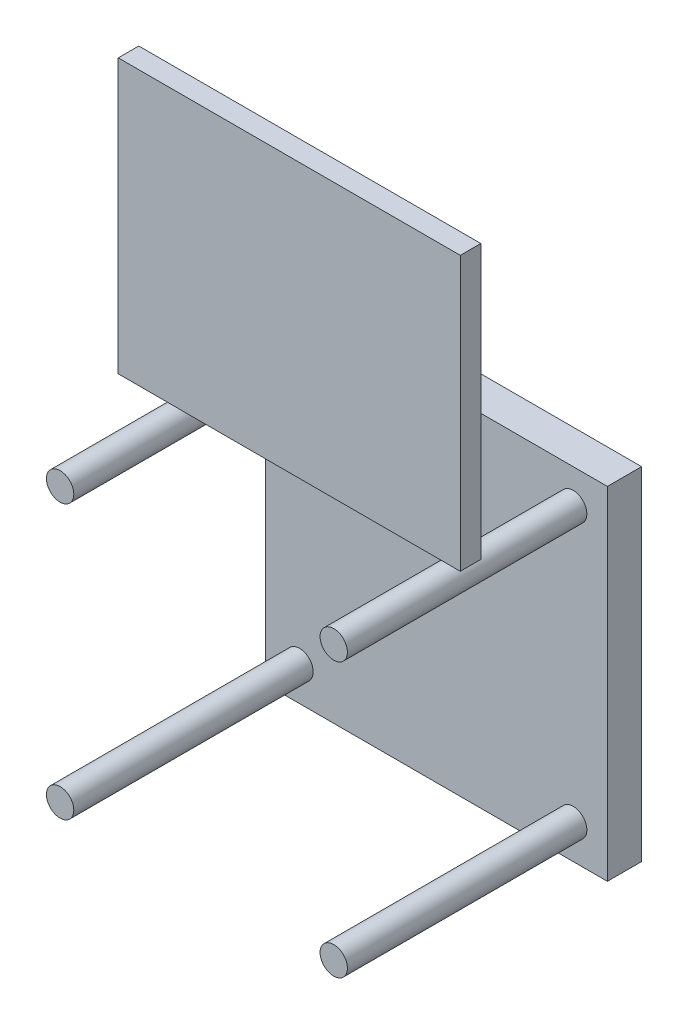
ISO-10303-21;
HEADER;
FILE_DESCRIPTION(('STEP AP214'),'2;1');
FILE_NAME('part.step','',(''),(''),'','','');
FILE_SCHEMA(('AUTOMOTIVE_DESIGN { 1 0 10303 214 1 1 1 1 }'));
ENDSEC;
DATA;
#1=APPLICATION_CONTEXT('core data for automotive mechanical design processes');
#2=APPLICATION_PROTOCOL_DEFINITION('international standard','automotive_design',2000,#1);
#3=PRODUCT_CONTEXT('',#1,'mechanical');
#4=PRODUCT('Part','Part','',(#3));
#5=PRODUCT_RELATED_PRODUCT_CATEGORY('part','',(#4));
#6=PRODUCT_DEFINITION_FORMATION('','',#4);
#7=PRODUCT_DEFINITION_CONTEXT('part definition',#1,'design');
#8=PRODUCT_DEFINITION('design','',#6,#7);
#9=PRODUCT_DEFINITION_SHAPE('','',#8);
#10=(LENGTH_UNIT() NAMED_UNIT(*) SI_UNIT(.MILLI.,.METRE.));
#11=(NAMED_UNIT(*) PLANE_ANGLE_UNIT() SI_UNIT($,.RADIAN.));
#12=(NAMED_UNIT(*) SI_UNIT($,.STERADIAN.) SOLID_ANGLE_UNIT());
#13=UNCERTAINTY_MEASURE_WITH_UNIT(LENGTH_MEASURE(1.E-05),#10,'distance_accuracy_value','');
#14=(GEOMETRIC_REPRESENTATION_CONTEXT(3) GLOBAL_UNCERTAINTY_ASSIGNED_CONTEXT((#13)) GLOBAL_UNIT_ASSIGNED_CONTEXT((#10,
#11,#12)) REPRESENTATION_CONTEXT('',''));
#15=CARTESIAN_POINT('',(0.,0.,0.));
#16=DIRECTION('',(0.,0.,1.));
#17=DIRECTION('',(1.,0.,0.));
#18=AXIS2_PLACEMENT_3D('',#15,#16,#17);
#19=CARTESIAN_POINT('',(250.,650.,265.));
#20=DIRECTION('',(-1.,0.,0.));
#21=DIRECTION('',(0.,0.,1.));
#22=AXIS2_PLACEMENT_3D('',#19,#20,#21);
#23=PLANE('',#22);
#24=DIRECTION('',(0.,0.,-1.));
#25=VECTOR('',#24,1.);
#26=CARTESIAN_POINT('',(250.,250.,265.));
#27=LINE('',#26,#25);
#28=CARTESIAN_POINT('',(250.,250.,265.));
#29=VERTEX_POINT('',#28);
#30=CARTESIAN_POINT('',(250.,250.,235.));
#31=VERTEX_POINT('',#30);
#32=EDGE_CURVE('E114',#29,#31,#27,.T.);
#33=ORIENTED_EDGE('',*,*,#32,.T.);
#34=DIRECTION('',(0.,-1.,0.));
#35=VECTOR('',#34,1.);
#36=CARTESIAN_POINT('',(250.,650.,235.));
#37=LINE('',#36,#35);
#38=CARTESIAN_POINT('',(250.,650.,235.));
#39=VERTEX_POINT('',#38);
#40=EDGE_CURVE('E12',#39,#31,#37,.T.);
#41=ORIENTED_EDGE('',*,*,#40,.F.);
#42=DIRECTION('',(0.,0.,-1.));
#43=VECTOR('',#42,1.);
#44=CARTESIAN_POINT('',(250.,650.,265.));
#45=LINE('',#44,#43);
#46=CARTESIAN_POINT('',(250.,650.,265.));
#47=VERTEX_POINT('',#46);
#48=EDGE_CURVE('E102',#47,#39,#45,.T.);
#49=ORIENTED_EDGE('',*,*,#48,.F.);
#50=DIRECTION('',(0.,-1.,0.));
#51=VECTOR('',#50,1.);
#52=CARTESIAN_POINT('',(250.,650.,265.));
#53=LINE('',#52,#51);
#54=EDGE_CURVE('E110',#47,#29,#53,.T.);
#55=ORIENTED_EDGE('',*,*,#54,.T.);
#56=EDGE_LOOP('',(#33,#41,#49,#55));
#57=FACE_BOUND('',#56,.T.);
#58=ADVANCED_FACE('F51',(#57),#23,.F.);
#59=CARTESIAN_POINT('',(-250.,650.,235.));
#60=DIRECTION('',(0.,0.,1.));
#61=DIRECTION('',(1.,0.,0.));
#62=AXIS2_PLACEMENT_3D('',#59,#60,#61);
#63=PLANE('',#62);
#64=DIRECTION('',(-1.,0.,0.));
#65=VECTOR('',#64,1.);
#66=CARTESIAN_POINT('',(-250.,250.,235.));
#67=LINE('',#66,#65);
#68=CARTESIAN_POINT('',(-250.,250.,235.));
#69=VERTEX_POINT('',#68);
#70=EDGE_CURVE('E106',#31,#69,#67,.T.);
#71=ORIENTED_EDGE('',*,*,#70,.T.);
#72=DIRECTION('',(0.,-1.,0.));
#73=VECTOR('',#72,1.);
#74=CARTESIAN_POINT('',(-250.,650.,235.));
#75=LINE('',#74,#73);
#76=CARTESIAN_POINT('',(-250.,650.,235.));
#77=VERTEX_POINT('',#76);
#78=EDGE_CURVE('E59',#77,#69,#75,.T.);
#79=ORIENTED_EDGE('',*,*,#78,.F.);
#80=DIRECTION('',(-1.,0.,0.));
#81=VECTOR('',#80,1.);
#82=CARTESIAN_POINT('',(-250.,650.,235.));
#83=LINE('',#82,#81);
#84=EDGE_CURVE('E97',#39,#77,#83,.T.);
#85=ORIENTED_EDGE('',*,*,#84,.F.);
#86=ORIENTED_EDGE('',*,*,#40,.T.);
#87=EDGE_LOOP('',(#71,#79,#85,#86));
#88=FACE_BOUND('',#87,.T.);
#89=ADVANCED_FACE('F105',(#88),#63,.F.);
#90=CARTESIAN_POINT('',(-250.,650.,265.));
#91=DIRECTION('',(1.,0.,0.));
#92=DIRECTION('',(0.,0.,-1.));
#93=AXIS2_PLACEMENT_3D('',#90,#91,#92);
#94=PLANE('',#93);
#95=DIRECTION('',(0.,0.,1.));
#96=VECTOR('',#95,1.);
#97=CARTESIAN_POINT('',(-250.,250.,265.));
#98=LINE('',#97,#96);
#99=CARTESIAN_POINT('',(-250.,250.,265.));
#100=VERTEX_POINT('',#99);
#101=EDGE_CURVE('E84',#69,#100,#98,.T.);
#102=ORIENTED_EDGE('',*,*,#101,.T.);
#103=DIRECTION('',(0.,-1.,0.));
#104=VECTOR('',#103,1.);
#105=CARTESIAN_POINT('',(-250.,650.,265.));
#106=LINE('',#105,#104);
#107=CARTESIAN_POINT('',(-250.,650.,265.));
#108=VERTEX_POINT('',#107);
#109=EDGE_CURVE('E107',#108,#100,#106,.T.);
#110=ORIENTED_EDGE('',*,*,#109,.F.);
#111=DIRECTION('',(0.,0.,1.));
#112=VECTOR('',#111,1.);
#113=CARTESIAN_POINT('',(-250.,650.,265.));
#114=LINE('',#113,#112);
#115=EDGE_CURVE('E100',#77,#108,#114,.T.);
#116=ORIENTED_EDGE('',*,*,#115,.F.);
#117=ORIENTED_EDGE('',*,*,#78,.T.);
#118=EDGE_LOOP('',(#102,#110,#116,#117));
#119=FACE_BOUND('',#118,.T.);
#120=ADVANCED_FACE('F108',(#119),#94,.F.);
#121=CARTESIAN_POINT('',(-250.,650.,265.));
#122=DIRECTION('',(0.,0.,-1.));
#123=DIRECTION('',(-1.,0.,0.));
#124=AXIS2_PLACEMENT_3D('',#121,#122,#123);
#125=PLANE('',#124);
#126=DIRECTION('',(1.,0.,0.));
#127=VECTOR('',#126,1.);
#128=CARTESIAN_POINT('',(-250.,250.,265.));
#129=LINE('',#128,#127);
#130=EDGE_CURVE('E90',#100,#29,#129,.T.);
#131=ORIENTED_EDGE('',*,*,#130,.T.);
#132=ORIENTED_EDGE('',*,*,#54,.F.);
#133=DIRECTION('',(1.,0.,0.));
#134=VECTOR('',#133,1.);
#135=CARTESIAN_POINT('',(-250.,650.,265.));
#136=LINE('',#135,#134);
#137=EDGE_CURVE('E67',#108,#47,#136,.T.);
#138=ORIENTED_EDGE('',*,*,#137,.F.);
#139=ORIENTED_EDGE('',*,*,#109,.T.);
#140=EDGE_LOOP('',(#131,#132,#138,#139));
#141=FACE_BOUND('',#140,.T.);
#142=ADVANCED_FACE('F121',(#141),#125,.F.);
#143=CARTESIAN_POINT('',(0.,650.,0.));
#144=DIRECTION('',(0.,-1.,0.));
#145=DIRECTION('',(0.,0.,-1.));
#146=AXIS2_PLACEMENT_3D('',#143,#144,#145);
#147=PLANE('',#146);
#148=ORIENTED_EDGE('',*,*,#48,.T.);
#149=ORIENTED_EDGE('',*,*,#84,.T.);
#150=ORIENTED_EDGE('',*,*,#115,.T.);
#151=ORIENTED_EDGE('',*,*,#137,.T.);
#152=EDGE_LOOP('',(#148,#149,#150,#151));
#153=FACE_BOUND('',#152,.T.);
#154=ADVANCED_FACE('F98',(#153),#147,.F.);
#155=CARTESIAN_POINT('',(0.,250.,0.));
#156=DIRECTION('',(0.,-1.,0.));
#157=DIRECTION('',(0.,0.,-1.));
#158=AXIS2_PLACEMENT_3D('',#155,#156,#157);
#159=PLANE('',#158);
#160=ORIENTED_EDGE('',*,*,#32,.F.);
#161=ORIENTED_EDGE('',*,*,#130,.F.);
#162=ORIENTED_EDGE('',*,*,#101,.F.);
#163=ORIENTED_EDGE('',*,*,#70,.F.);
#164=EDGE_LOOP('',(#160,#161,#162,#163));
#165=FACE_BOUND('',#164,.T.);
#166=ADVANCED_FACE('F124',(#165),#159,.T.);
#167=CLOSED_SHELL('',(#58,#89,#120,#142,#154,#166));
#168=MANIFOLD_SOLID_BREP('B2',#167);
#169=CARTESIAN_POINT('',(250.,-250.,50.));
#170=DIRECTION('',(-1.,0.,0.));
#171=DIRECTION('',(0.,0.,1.));
#172=AXIS2_PLACEMENT_3D('',#169,#170,#171);
#173=PLANE('',#172);
#174=DIRECTION('',(0.,1.,0.));
#175=VECTOR('',#174,1.);
#176=CARTESIAN_POINT('',(250.,-250.,0.));
#177=LINE('',#176,#175);
#178=CARTESIAN_POINT('',(250.,-250.,0.));
#179=VERTEX_POINT('',#178);
#180=CARTESIAN_POINT('',(250.,250.,0.));
#181=VERTEX_POINT('',#180);
#182=EDGE_CURVE('E242',#179,#181,#177,.T.);
#183=ORIENTED_EDGE('',*,*,#182,.T.);
#184=DIRECTION('',(0.,0.,-1.));
#185=VECTOR('',#184,1.);
#186=CARTESIAN_POINT('',(250.,250.,50.));
#187=LINE('',#186,#185);
#188=CARTESIAN_POINT('',(250.,250.,50.));
#189=VERTEX_POINT('',#188);
#190=EDGE_CURVE('E178',#189,#181,#187,.T.);
#191=ORIENTED_EDGE('',*,*,#190,.F.);
#192=DIRECTION('',(0.,1.,0.));
#193=VECTOR('',#192,1.);
#194=CARTESIAN_POINT('',(250.,-250.,50.));
#195=LINE('',#194,#193);
#196=CARTESIAN_POINT('',(250.,-250.,50.));
#197=VERTEX_POINT('',#196);
#198=EDGE_CURVE('E229',#197,#189,#195,.T.);
#199=ORIENTED_EDGE('',*,*,#198,.F.);
#200=DIRECTION('',(0.,0.,-1.));
#201=VECTOR('',#200,1.);
#202=CARTESIAN_POINT('',(250.,-250.,50.));
#203=LINE('',#202,#201);
#204=EDGE_CURVE('E238',#197,#179,#203,.T.);
#205=ORIENTED_EDGE('',*,*,#204,.T.);
#206=EDGE_LOOP('',(#183,#191,#199,#205));
#207=FACE_BOUND('',#206,.T.);
#208=ADVANCED_FACE('F175',(#207),#173,.F.);
#209=CARTESIAN_POINT('',(-250.,250.,50.));
#210=DIRECTION('',(0.,-1.,0.));
#211=DIRECTION('',(0.,0.,-1.));
#212=AXIS2_PLACEMENT_3D('',#209,#210,#211);
#213=PLANE('',#212);
#214=DIRECTION('',(-1.,0.,0.));
#215=VECTOR('',#214,1.);
#216=CARTESIAN_POINT('',(-250.,250.,0.));
#217=LINE('',#216,#215);
#218=CARTESIAN_POINT('',(-250.,250.,0.));
#219=VERTEX_POINT('',#218);
#220=EDGE_CURVE('E234',#181,#219,#217,.T.);
#221=ORIENTED_EDGE('',*,*,#220,.T.);
#222=DIRECTION('',(0.,0.,-1.));
#223=VECTOR('',#222,1.);
#224=CARTESIAN_POINT('',(-250.,250.,50.));
#225=LINE('',#224,#223);
#226=CARTESIAN_POINT('',(-250.,250.,50.));
#227=VERTEX_POINT('',#226);
#228=EDGE_CURVE('E232',#227,#219,#225,.T.);
#229=ORIENTED_EDGE('',*,*,#228,.F.);
#230=DIRECTION('',(-1.,0.,0.));
#231=VECTOR('',#230,1.);
#232=CARTESIAN_POINT('',(-250.,250.,50.));
#233=LINE('',#232,#231);
#234=EDGE_CURVE('E224',#189,#227,#233,.T.);
#235=ORIENTED_EDGE('',*,*,#234,.F.);
#236=ORIENTED_EDGE('',*,*,#190,.T.);
#237=EDGE_LOOP('',(#221,#229,#235,#236));
#238=FACE_BOUND('',#237,.T.);
#239=ADVANCED_FACE('F233',(#238),#213,.F.);
#240=CARTESIAN_POINT('',(-250.,-250.,50.));
#241=DIRECTION('',(1.,0.,0.));
#242=DIRECTION('',(0.,0.,-1.));
#243=AXIS2_PLACEMENT_3D('',#240,#241,#242);
#244=PLANE('',#243);
#245=DIRECTION('',(0.,-1.,0.));
#246=VECTOR('',#245,1.);
#247=CARTESIAN_POINT('',(-250.,-250.,0.));
#248=LINE('',#247,#246);
#249=CARTESIAN_POINT('',(-250.,-250.,0.));
#250=VERTEX_POINT('',#249);
#251=EDGE_CURVE('E210',#219,#250,#248,.T.);
#252=ORIENTED_EDGE('',*,*,#251,.T.);
#253=DIRECTION('',(0.,0.,-1.));
#254=VECTOR('',#253,1.);
#255=CARTESIAN_POINT('',(-250.,-250.,50.));
#256=LINE('',#255,#254);
#257=CARTESIAN_POINT('',(-250.,-250.,50.));
#258=VERTEX_POINT('',#257);
#259=EDGE_CURVE('E235',#258,#250,#256,.T.);
#260=ORIENTED_EDGE('',*,*,#259,.F.);
#261=DIRECTION('',(0.,-1.,0.));
#262=VECTOR('',#261,1.);
#263=CARTESIAN_POINT('',(-250.,-250.,50.));
#264=LINE('',#263,#262);
#265=EDGE_CURVE('E227',#227,#258,#264,.T.);
#266=ORIENTED_EDGE('',*,*,#265,.F.);
#267=ORIENTED_EDGE('',*,*,#228,.T.);
#268=EDGE_LOOP('',(#252,#260,#266,#267));
#269=FACE_BOUND('',#268,.T.);
#270=ADVANCED_FACE('F236',(#269),#244,.F.);
#271=CARTESIAN_POINT('',(-250.,-250.,50.));
#272=DIRECTION('',(0.,1.,0.));
#273=DIRECTION('',(0.,0.,1.));
#274=AXIS2_PLACEMENT_3D('',#271,#272,#273);
#275=PLANE('',#274);
#276=DIRECTION('',(1.,0.,0.));
#277=VECTOR('',#276,1.);
#278=CARTESIAN_POINT('',(-250.,-250.,0.));
#279=LINE('',#278,#277);
#280=EDGE_CURVE('E216',#250,#179,#279,.T.);
#281=ORIENTED_EDGE('',*,*,#280,.T.);
#282=ORIENTED_EDGE('',*,*,#204,.F.);
#283=DIRECTION('',(1.,0.,0.));
#284=VECTOR('',#283,1.);
#285=CARTESIAN_POINT('',(-250.,-250.,50.));
#286=LINE('',#285,#284);
#287=EDGE_CURVE('E193',#258,#197,#286,.T.);
#288=ORIENTED_EDGE('',*,*,#287,.F.);
#289=ORIENTED_EDGE('',*,*,#259,.T.);
#290=EDGE_LOOP('',(#281,#282,#288,#289));
#291=FACE_BOUND('',#290,.T.);
#292=ADVANCED_FACE('F250',(#291),#275,.F.);
#293=CARTESIAN_POINT('',(0.,0.,50.));
#294=DIRECTION('',(0.,0.,-1.));
#295=DIRECTION('',(-1.,0.,0.));
#296=AXIS2_PLACEMENT_3D('',#293,#294,#295);
#297=PLANE('',#296);
#298=CARTESIAN_POINT('',(200.,200.,50.));
#299=DIRECTION('',(0.,0.,-1.));
#300=DIRECTION('',(-1.,0.,0.));
#301=AXIS2_PLACEMENT_3D('',#298,#299,#300);
#302=CIRCLE('',#301,20.);
#303=CARTESIAN_POINT('',(180.,200.,50.));
#304=VERTEX_POINT('',#303);
#305=EDGE_CURVE('E49',#304,#304,#302,.F.);
#306=ORIENTED_EDGE('',*,*,#305,.F.);
#307=EDGE_LOOP('',(#306));
#308=FACE_BOUND('',#307,.T.);
#309=CARTESIAN_POINT('',(-200.,200.,50.));
#310=DIRECTION('',(0.,0.,-1.));
#311=DIRECTION('',(-1.,0.,0.));
#312=AXIS2_PLACEMENT_3D('',#309,#310,#311);
#313=CIRCLE('',#312,20.);
#314=CARTESIAN_POINT('',(-220.,200.,50.));
#315=VERTEX_POINT('',#314);
#316=EDGE_CURVE('E184',#315,#315,#313,.F.);
#317=ORIENTED_EDGE('',*,*,#316,.F.);
#318=EDGE_LOOP('',(#317));
#319=FACE_BOUND('',#318,.T.);
#320=CARTESIAN_POINT('',(200.,-200.,50.));
#321=DIRECTION('',(0.,0.,-1.));
#322=DIRECTION('',(-1.,0.,0.));
#323=AXIS2_PLACEMENT_3D('',#320,#321,#322);
#324=CIRCLE('',#323,20.);
#325=CARTESIAN_POINT('',(180.,-200.,50.));
#326=VERTEX_POINT('',#325);
#327=EDGE_CURVE('E259',#326,#326,#324,.F.);
#328=ORIENTED_EDGE('',*,*,#327,.F.);
#329=EDGE_LOOP('',(#328));
#330=FACE_BOUND('',#329,.T.);
#331=CARTESIAN_POINT('',(-200.,-200.,50.));
#332=DIRECTION('',(0.,0.,-1.));
#333=DIRECTION('',(-1.,0.,0.));
#334=AXIS2_PLACEMENT_3D('',#331,#332,#333);
#335=CIRCLE('',#334,20.);
#336=CARTESIAN_POINT('',(-220.,-200.,50.));
#337=VERTEX_POINT('',#336);
#338=EDGE_CURVE('E256',#337,#337,#335,.F.);
#339=ORIENTED_EDGE('',*,*,#338,.F.);
#340=EDGE_LOOP('',(#339));
#341=FACE_BOUND('',#340,.T.);
#342=ORIENTED_EDGE('',*,*,#198,.T.);
#343=ORIENTED_EDGE('',*,*,#234,.T.);
#344=ORIENTED_EDGE('',*,*,#265,.T.);
#345=ORIENTED_EDGE('',*,*,#287,.T.);
#346=EDGE_LOOP('',(#342,#343,#344,#345));
#347=FACE_BOUND('',#346,.T.);
#348=ADVANCED_FACE('F225',(#308,#319,#330,#341,#347),#297,.F.);
#349=CARTESIAN_POINT('',(0.,0.,0.));
#350=DIRECTION('',(0.,0.,-1.));
#351=DIRECTION('',(-1.,0.,0.));
#352=AXIS2_PLACEMENT_3D('',#349,#350,#351);
#353=PLANE('',#352);
#354=ORIENTED_EDGE('',*,*,#182,.F.);
#355=ORIENTED_EDGE('',*,*,#280,.F.);
#356=ORIENTED_EDGE('',*,*,#251,.F.);
#357=ORIENTED_EDGE('',*,*,#220,.F.);
#358=EDGE_LOOP('',(#354,#355,#356,#357));
#359=FACE_BOUND('',#358,.T.);
#360=ADVANCED_FACE('F253',(#359),#353,.T.);
#361=CARTESIAN_POINT('',(-200.,-200.,400.));
#362=DIRECTION('',(0.,0.,-1.));
#363=DIRECTION('',(-1.,0.,0.));
#364=AXIS2_PLACEMENT_3D('',#361,#362,#363);
#365=CYLINDRICAL_SURFACE('',#364,20.);
#366=CARTESIAN_POINT('',(-200.,-200.,400.));
#367=DIRECTION('',(0.,0.,1.));
#368=DIRECTION('',(1.,0.,0.));
#369=AXIS2_PLACEMENT_3D('',#366,#367,#368);
#370=CIRCLE('',#369,20.);
#371=CARTESIAN_POINT('',(-180.,-200.,400.));
#372=VERTEX_POINT('',#371);
#373=EDGE_CURVE('E245',#372,#372,#370,.T.);
#374=ORIENTED_EDGE('',*,*,#373,.F.);
#375=EDGE_LOOP('',(#374));
#376=FACE_BOUND('',#375,.T.);
#377=ORIENTED_EDGE('',*,*,#338,.T.);
#378=EDGE_LOOP('',(#377));
#379=FACE_BOUND('',#378,.T.);
#380=ADVANCED_FACE('F294',(#376,#379),#365,.T.);
#381=CARTESIAN_POINT('',(-200.,-200.,400.));
#382=DIRECTION('',(0.,0.,1.));
#383=DIRECTION('',(1.,0.,0.));
#384=AXIS2_PLACEMENT_3D('',#381,#382,#383);
#385=PLANE('',#384);
#386=ORIENTED_EDGE('',*,*,#373,.T.);
#387=EDGE_LOOP('',(#386));
#388=FACE_BOUND('',#387,.T.);
#389=ADVANCED_FACE('F296',(#388),#385,.T.);
#390=CARTESIAN_POINT('',(200.,-200.,400.));
#391=DIRECTION('',(0.,0.,-1.));
#392=DIRECTION('',(-1.,0.,0.));
#393=AXIS2_PLACEMENT_3D('',#390,#391,#392);
#394=CYLINDRICAL_SURFACE('',#393,20.);
#395=CARTESIAN_POINT('',(200.,-200.,400.));
#396=DIRECTION('',(0.,0.,1.));
#397=DIRECTION('',(1.,0.,0.));
#398=AXIS2_PLACEMENT_3D('',#395,#396,#397);
#399=CIRCLE('',#398,20.);
#400=CARTESIAN_POINT('',(220.,-200.,400.));
#401=VERTEX_POINT('',#400);
#402=EDGE_CURVE('E262',#401,#401,#399,.T.);
#403=ORIENTED_EDGE('',*,*,#402,.F.);
#404=EDGE_LOOP('',(#403));
#405=FACE_BOUND('',#404,.T.);
#406=ORIENTED_EDGE('',*,*,#327,.T.);
#407=EDGE_LOOP('',(#406));
#408=FACE_BOUND('',#407,.T.);
#409=ADVANCED_FACE('F303',(#405,#408),#394,.T.);
#410=CARTESIAN_POINT('',(200.,-200.,400.));
#411=DIRECTION('',(0.,0.,1.));
#412=DIRECTION('',(1.,0.,0.));
#413=AXIS2_PLACEMENT_3D('',#410,#411,#412);
#414=PLANE('',#413);
#415=ORIENTED_EDGE('',*,*,#402,.T.);
#416=EDGE_LOOP('',(#415));
#417=FACE_BOUND('',#416,.T.);
#418=ADVANCED_FACE('F362',(#417),#414,.T.);
#419=CARTESIAN_POINT('',(-200.,200.,400.));
#420=DIRECTION('',(0.,0.,-1.));
#421=DIRECTION('',(-1.,0.,0.));
#422=AXIS2_PLACEMENT_3D('',#419,#420,#421);
#423=CYLINDRICAL_SURFACE('',#422,20.);
#424=CARTESIAN_POINT('',(-200.,200.,400.));
#425=DIRECTION('',(0.,0.,1.));
#426=DIRECTION('',(1.,0.,0.));
#427=AXIS2_PLACEMENT_3D('',#424,#425,#426);
#428=CIRCLE('',#427,20.);
#429=CARTESIAN_POINT('',(-180.,200.,400.));
#430=VERTEX_POINT('',#429);
#431=EDGE_CURVE('E267',#430,#430,#428,.T.);
#432=ORIENTED_EDGE('',*,*,#431,.F.);
#433=EDGE_LOOP('',(#432));
#434=FACE_BOUND('',#433,.T.);
#435=ORIENTED_EDGE('',*,*,#316,.T.);
#436=EDGE_LOOP('',(#435));
#437=FACE_BOUND('',#436,.T.);
#438=ADVANCED_FACE('F371',(#434,#437),#423,.T.);
#439=CARTESIAN_POINT('',(-200.,200.,400.));
#440=DIRECTION('',(0.,0.,1.));
#441=DIRECTION('',(1.,0.,0.));
#442=AXIS2_PLACEMENT_3D('',#439,#440,#441);
#443=PLANE('',#442);
#444=ORIENTED_EDGE('',*,*,#431,.T.);
#445=EDGE_LOOP('',(#444));
#446=FACE_BOUND('',#445,.T.);
#447=ADVANCED_FACE('F281',(#446),#443,.T.);
#448=CARTESIAN_POINT('',(200.,200.,400.));
#449=DIRECTION('',(0.,0.,-1.));
#450=DIRECTION('',(-1.,0.,0.));
#451=AXIS2_PLACEMENT_3D('',#448,#449,#450);
#452=CYLINDRICAL_SURFACE('',#451,20.);
#453=CARTESIAN_POINT('',(200.,200.,400.));
#454=DIRECTION('',(0.,0.,1.));
#455=DIRECTION('',(1.,0.,0.));
#456=AXIS2_PLACEMENT_3D('',#453,#454,#455);
#457=CIRCLE('',#456,20.);
#458=CARTESIAN_POINT('',(220.,200.,400.));
#459=VERTEX_POINT('',#458);
#460=EDGE_CURVE('E271',#459,#459,#457,.T.);
#461=ORIENTED_EDGE('',*,*,#460,.F.);
#462=EDGE_LOOP('',(#461));
#463=FACE_BOUND('',#462,.T.);
#464=ORIENTED_EDGE('',*,*,#305,.T.);
#465=EDGE_LOOP('',(#464));
#466=FACE_BOUND('',#465,.T.);
#467=ADVANCED_FACE('F278',(#463,#466),#452,.T.);
#468=CARTESIAN_POINT('',(200.,200.,400.));
#469=DIRECTION('',(0.,0.,1.));
#470=DIRECTION('',(1.,0.,0.));
#471=AXIS2_PLACEMENT_3D('',#468,#469,#470);
#472=PLANE('',#471);
#473=ORIENTED_EDGE('',*,*,#460,.T.);
#474=EDGE_LOOP('',(#473));
#475=FACE_BOUND('',#474,.T.);
#476=ADVANCED_FACE('F276',(#475),#472,.T.);
#477=CLOSED_SHELL('',(#208,#239,#270,#292,#348,#360,#380,#389,#409,#418,#438,#447,#467,#476));
#478=MANIFOLD_SOLID_BREP('B6',#477);
#479=ADVANCED_BREP_SHAPE_REPRESENTATION('',(#18,#168,#478),#14);
#480=SHAPE_DEFINITION_REPRESENTATION(#9,#479);
ENDSEC;
END-ISO-10303-21;
